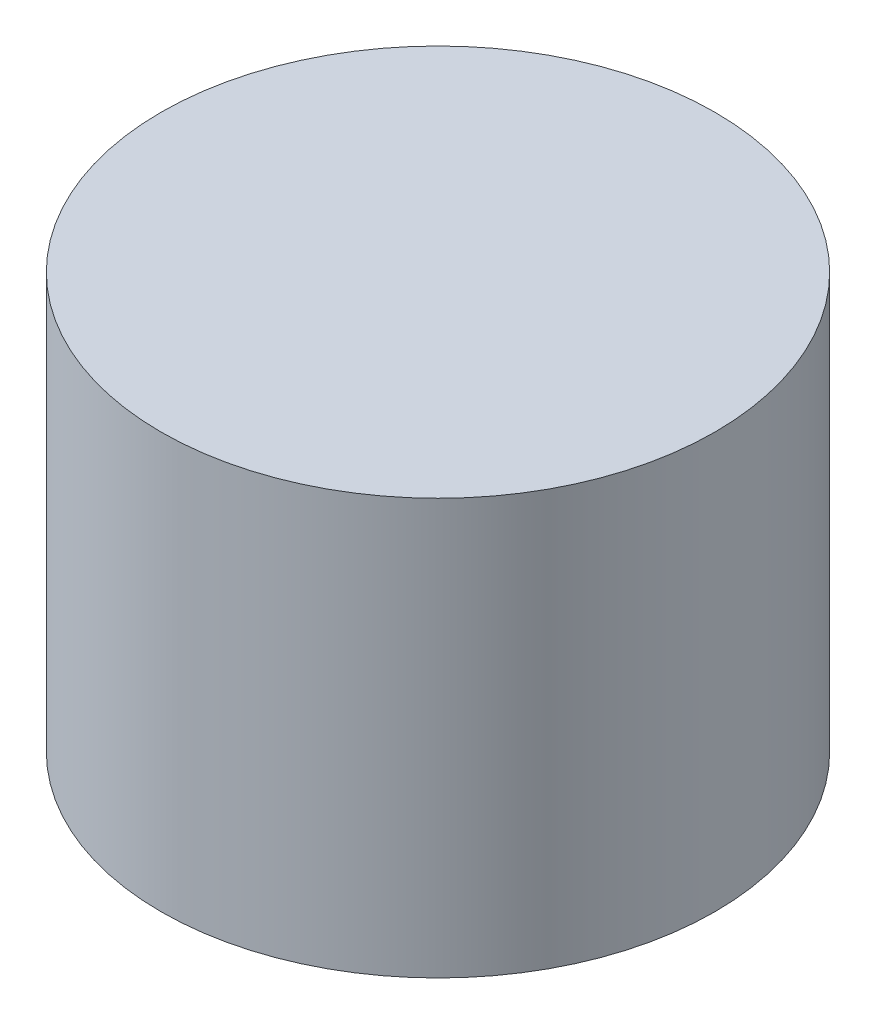
ISO-10303-21;
HEADER;
FILE_DESCRIPTION(('STEP AP214'),'2;1');
FILE_NAME('part.step','',(''),(''),'','','');
FILE_SCHEMA(('AUTOMOTIVE_DESIGN { 1 0 10303 214 1 1 1 1 }'));
ENDSEC;
DATA;
#1=APPLICATION_CONTEXT('core data for automotive mechanical design processes');
#2=APPLICATION_PROTOCOL_DEFINITION('international standard','automotive_design',2000,#1);
#3=PRODUCT_CONTEXT('',#1,'mechanical');
#4=PRODUCT('Part','Part','',(#3));
#5=PRODUCT_RELATED_PRODUCT_CATEGORY('part','',(#4));
#6=PRODUCT_DEFINITION_FORMATION('','',#4);
#7=PRODUCT_DEFINITION_CONTEXT('part definition',#1,'design');
#8=PRODUCT_DEFINITION('design','',#6,#7);
#9=PRODUCT_DEFINITION_SHAPE('','',#8);
#10=(LENGTH_UNIT() NAMED_UNIT(*) SI_UNIT(.MILLI.,.METRE.));
#11=(NAMED_UNIT(*) PLANE_ANGLE_UNIT() SI_UNIT($,.RADIAN.));
#12=(NAMED_UNIT(*) SI_UNIT($,.STERADIAN.) SOLID_ANGLE_UNIT());
#13=UNCERTAINTY_MEASURE_WITH_UNIT(LENGTH_MEASURE(1.E-05),#10,'distance_accuracy_value','');
#14=(GEOMETRIC_REPRESENTATION_CONTEXT(3) GLOBAL_UNCERTAINTY_ASSIGNED_CONTEXT((#13)) GLOBAL_UNIT_ASSIGNED_CONTEXT((#10,
#11,#12)) REPRESENTATION_CONTEXT('',''));
#15=CARTESIAN_POINT('',(0.,0.,0.));
#16=DIRECTION('',(0.,0.,1.));
#17=DIRECTION('',(1.,0.,0.));
#18=AXIS2_PLACEMENT_3D('',#15,#16,#17);
#19=CARTESIAN_POINT('',(0.,76.2,0.));
#20=DIRECTION('',(0.,-1.,0.));
#21=DIRECTION('',(0.,0.,-1.));
#22=AXIS2_PLACEMENT_3D('',#19,#20,#21);
#23=CYLINDRICAL_SURFACE('',#22,50.8);
#24=CARTESIAN_POINT('',(0.,76.2,0.));
#25=DIRECTION('',(0.,1.,0.));
#26=DIRECTION('',(0.,0.,1.));
#27=AXIS2_PLACEMENT_3D('',#24,#25,#26);
#28=CIRCLE('',#27,50.8);
#29=CARTESIAN_POINT('',(0.,76.2,-50.8));
#30=VERTEX_POINT('',#29);
#31=EDGE_CURVE('E10',#30,#30,#28,.T.);
#32=CARTESIAN_POINT('',(0.,0.,0.));
#33=DIRECTION('',(0.,1.,0.));
#34=DIRECTION('',(0.,0.,1.));
#35=AXIS2_PLACEMENT_3D('',#32,#33,#34);
#36=CIRCLE('',#35,50.8);
#37=CARTESIAN_POINT('',(0.,0.,-50.8));
#38=VERTEX_POINT('',#37);
#39=EDGE_CURVE('E34',#38,#38,#36,.T.);
#40=CARTESIAN_POINT('',(0.,76.2,-50.8));
#41=CARTESIAN_POINT('',(0.,75.40625,-50.8));
#42=CARTESIAN_POINT('',(0.,74.6125,-50.8));
#43=CARTESIAN_POINT('',(0.,73.025,-50.8));
#44=CARTESIAN_POINT('',(0.,72.23125,-50.8));
#45=CARTESIAN_POINT('',(0.,70.64375,-50.8));
#46=CARTESIAN_POINT('',(0.,69.85,-50.8));
#47=CARTESIAN_POINT('',(0.,68.2625,-50.8));
#48=CARTESIAN_POINT('',(0.,67.46875,-50.8));
#49=CARTESIAN_POINT('',(0.,65.88125,-50.8));
#50=CARTESIAN_POINT('',(0.,65.0875,-50.8));
#51=CARTESIAN_POINT('',(0.,63.5,-50.8));
#52=CARTESIAN_POINT('',(0.,62.70625,-50.8));
#53=CARTESIAN_POINT('',(0.,61.11875,-50.8));
#54=CARTESIAN_POINT('',(0.,60.325,-50.8));
#55=CARTESIAN_POINT('',(0.,58.7375,-50.8));
#56=CARTESIAN_POINT('',(0.,57.94375,-50.8));
#57=CARTESIAN_POINT('',(0.,56.35625,-50.8));
#58=CARTESIAN_POINT('',(0.,55.5625,-50.8));
#59=CARTESIAN_POINT('',(0.,53.975,-50.8));
#60=CARTESIAN_POINT('',(0.,53.18125,-50.8));
#61=CARTESIAN_POINT('',(0.,51.59375,-50.8));
#62=CARTESIAN_POINT('',(0.,50.8,-50.8));
#63=CARTESIAN_POINT('',(0.,49.2125,-50.8));
#64=CARTESIAN_POINT('',(0.,48.41875,-50.8));
#65=CARTESIAN_POINT('',(0.,46.83125,-50.8));
#66=CARTESIAN_POINT('',(0.,46.0375,-50.8));
#67=CARTESIAN_POINT('',(0.,44.45,-50.8));
#68=CARTESIAN_POINT('',(0.,43.65625,-50.8));
#69=CARTESIAN_POINT('',(0.,42.06875,-50.8));
#70=CARTESIAN_POINT('',(0.,41.275,-50.8));
#71=CARTESIAN_POINT('',(0.,39.6875,-50.8));
#72=CARTESIAN_POINT('',(0.,38.89375,-50.8));
#73=CARTESIAN_POINT('',(0.,37.30625,-50.8));
#74=CARTESIAN_POINT('',(0.,36.5125,-50.8));
#75=CARTESIAN_POINT('',(0.,34.925,-50.8));
#76=CARTESIAN_POINT('',(0.,34.13125,-50.8));
#77=CARTESIAN_POINT('',(0.,32.54375,-50.8));
#78=CARTESIAN_POINT('',(0.,31.75,-50.8));
#79=CARTESIAN_POINT('',(0.,30.1625,-50.8));
#80=CARTESIAN_POINT('',(0.,29.36875,-50.8));
#81=CARTESIAN_POINT('',(0.,27.78125,-50.8));
#82=CARTESIAN_POINT('',(0.,26.9875,-50.8));
#83=CARTESIAN_POINT('',(0.,25.4,-50.8));
#84=CARTESIAN_POINT('',(0.,24.60625,-50.8));
#85=CARTESIAN_POINT('',(0.,23.01875,-50.8));
#86=CARTESIAN_POINT('',(0.,22.225,-50.8));
#87=CARTESIAN_POINT('',(0.,20.6375,-50.8));
#88=CARTESIAN_POINT('',(0.,19.84375,-50.8));
#89=CARTESIAN_POINT('',(0.,18.25625,-50.8));
#90=CARTESIAN_POINT('',(0.,17.4625,-50.8));
#91=CARTESIAN_POINT('',(0.,15.875,-50.8));
#92=CARTESIAN_POINT('',(0.,15.08125,-50.8));
#93=CARTESIAN_POINT('',(0.,13.49375,-50.8));
#94=CARTESIAN_POINT('',(0.,12.7,-50.8));
#95=CARTESIAN_POINT('',(0.,11.1125,-50.8));
#96=CARTESIAN_POINT('',(0.,10.31875,-50.8));
#97=CARTESIAN_POINT('',(0.,8.73125,-50.8));
#98=CARTESIAN_POINT('',(0.,7.93750000000001,-50.8));
#99=CARTESIAN_POINT('',(0.,6.35,-50.8));
#100=CARTESIAN_POINT('',(0.,5.55625,-50.8));
#101=CARTESIAN_POINT('',(0.,3.96875,-50.8));
#102=CARTESIAN_POINT('',(0.,3.175,-50.8));
#103=CARTESIAN_POINT('',(0.,1.5875,-50.8));
#104=CARTESIAN_POINT('',(0.,0.793750000000001,-50.8));
#105=CARTESIAN_POINT('',(0.,0.,-50.8));
#106=B_SPLINE_CURVE_WITH_KNOTS('',3,(#40,#41,#42,#43,#44,#45,#46,#47,#48,#49,#50,#51,#52,#53,
#54,#55,#56,#57,#58,#59,#60,#61,#62,#63,#64,#65,#66,#67,#68,#69,#70,#71,#72,#73,#74,#75,#76,#77,
#78,#79,#80,#81,#82,#83,#84,#85,#86,#87,#88,#89,#90,#91,#92,#93,#94,#95,#96,#97,#98,#99,#100,
#101,#102,#103,#104,#105),.UNSPECIFIED.,.F.,.F.,(4,2,2,2,2,2,2,2,2,2,2,2,2,2,2,2,2,2,2,2,2,2,2,
2,2,2,2,2,2,2,2,2,4),(0.,2.38124999999999,4.76249999999999,7.14374999999999,9.52499999999999,
11.90625,14.2875,16.66875,19.05,21.43125,23.8125,26.19375,28.575,30.95625,33.3375,35.71875,38.1,
40.48125,42.8625,45.24375,47.625,50.00625,52.3875,54.76875,57.15,59.53125,61.9125,64.29375,
66.675,69.05625,71.4375,73.81875,76.2),.UNSPECIFIED.);
#107=EDGE_CURVE('BSEAM31',#30,#38,#106,.T.);
#108=ORIENTED_EDGE('',*,*,#31,.F.);
#109=ORIENTED_EDGE('',*,*,#39,.T.);
#110=ORIENTED_EDGE('',*,*,#107,.T.);
#111=ORIENTED_EDGE('',*,*,#107,.F.);
#112=EDGE_LOOP('',(#108,#110,#109,#111));
#113=FACE_BOUND('',#112,.T.);
#114=ADVANCED_FACE('F31',(#113),#23,.T.);
#115=CARTESIAN_POINT('',(0.,76.2,0.));
#116=DIRECTION('',(0.,1.,0.));
#117=DIRECTION('',(0.,0.,1.));
#118=AXIS2_PLACEMENT_3D('',#115,#116,#117);
#119=PLANE('',#118);
#120=ORIENTED_EDGE('',*,*,#31,.T.);
#121=EDGE_LOOP('',(#120));
#122=FACE_BOUND('',#121,.T.);
#123=ADVANCED_FACE('F46',(#122),#119,.T.);
#124=CARTESIAN_POINT('',(0.,0.,0.));
#125=DIRECTION('',(0.,1.,0.));
#126=DIRECTION('',(0.,0.,1.));
#127=AXIS2_PLACEMENT_3D('',#124,#125,#126);
#128=PLANE('',#127);
#129=ORIENTED_EDGE('',*,*,#39,.F.);
#130=EDGE_LOOP('',(#129));
#131=FACE_BOUND('',#130,.T.);
#132=ADVANCED_FACE('F44',(#131),#128,.F.);
#133=CLOSED_SHELL('',(#114,#123,#132));
#134=MANIFOLD_SOLID_BREP('B2',#133);
#135=ADVANCED_BREP_SHAPE_REPRESENTATION('',(#18,#134),#14);
#136=SHAPE_DEFINITION_REPRESENTATION(#9,#135);
ENDSEC;
END-ISO-10303-21;
